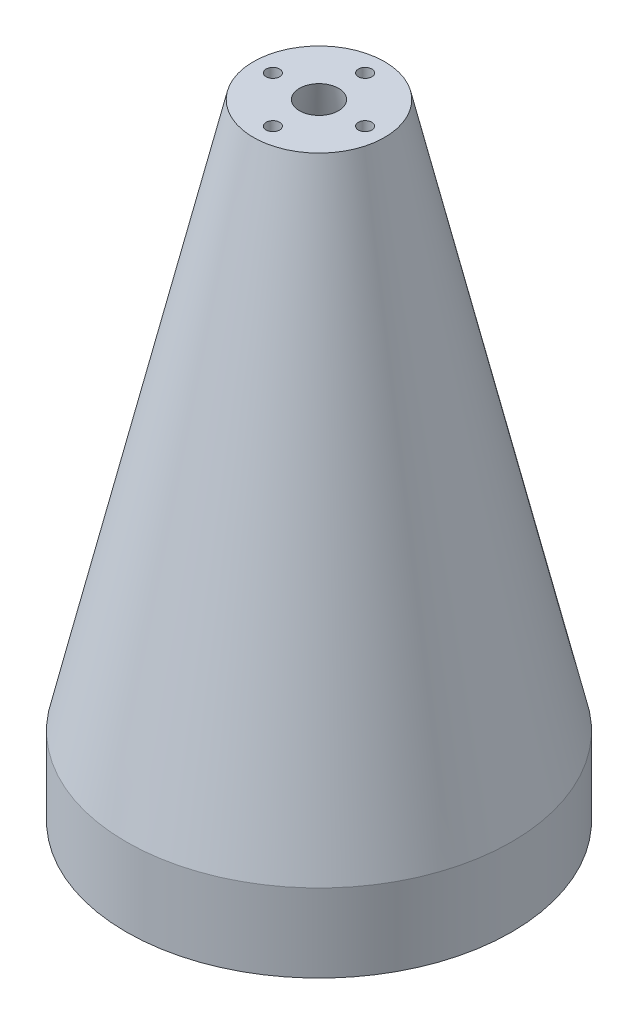
ISO-10303-21;
HEADER;
FILE_DESCRIPTION(('STEP AP214'),'2;1');
FILE_NAME('part.step','',(''),(''),'','','');
FILE_SCHEMA(('AUTOMOTIVE_DESIGN { 1 0 10303 214 1 1 1 1 }'));
ENDSEC;
DATA;
#1=APPLICATION_CONTEXT('core data for automotive mechanical design processes');
#2=APPLICATION_PROTOCOL_DEFINITION('international standard','automotive_design',2000,#1);
#3=PRODUCT_CONTEXT('',#1,'mechanical');
#4=PRODUCT('Part','Part','',(#3));
#5=PRODUCT_RELATED_PRODUCT_CATEGORY('part','',(#4));
#6=PRODUCT_DEFINITION_FORMATION('','',#4);
#7=PRODUCT_DEFINITION_CONTEXT('part definition',#1,'design');
#8=PRODUCT_DEFINITION('design','',#6,#7);
#9=PRODUCT_DEFINITION_SHAPE('','',#8);
#10=(LENGTH_UNIT() NAMED_UNIT(*) SI_UNIT(.MILLI.,.METRE.));
#11=(NAMED_UNIT(*) PLANE_ANGLE_UNIT() SI_UNIT($,.RADIAN.));
#12=(NAMED_UNIT(*) SI_UNIT($,.STERADIAN.) SOLID_ANGLE_UNIT());
#13=UNCERTAINTY_MEASURE_WITH_UNIT(LENGTH_MEASURE(1.E-05),#10,'distance_accuracy_value','');
#14=(GEOMETRIC_REPRESENTATION_CONTEXT(3) GLOBAL_UNCERTAINTY_ASSIGNED_CONTEXT((#13)) GLOBAL_UNIT_ASSIGNED_CONTEXT((#10,
#11,#12)) REPRESENTATION_CONTEXT('',''));
#15=CARTESIAN_POINT('',(0.,0.,0.));
#16=DIRECTION('',(0.,0.,1.));
#17=DIRECTION('',(1.,0.,0.));
#18=AXIS2_PLACEMENT_3D('',#15,#16,#17);
#19=CARTESIAN_POINT('',(0.,0.,0.));
#20=DIRECTION('',(0.,-1.,0.));
#21=DIRECTION('',(0.,0.,-1.));
#22=AXIS2_PLACEMENT_3D('',#19,#20,#21);
#23=CYLINDRICAL_SURFACE('',#22,62.6885);
#24=CARTESIAN_POINT('',(0.,25.4,0.));
#25=DIRECTION('',(0.,-1.,0.));
#26=DIRECTION('',(0.,0.,-1.));
#27=AXIS2_PLACEMENT_3D('',#24,#25,#26);
#28=CIRCLE('',#27,62.6885);
#29=CARTESIAN_POINT('',(0.,25.4,-62.6885));
#30=VERTEX_POINT('',#29);
#31=EDGE_CURVE('E10',#30,#30,#28,.T.);
#32=ORIENTED_EDGE('',*,*,#31,.T.);
#33=EDGE_LOOP('',(#32));
#34=FACE_BOUND('',#33,.T.);
#35=CARTESIAN_POINT('',(0.,0.,0.));
#36=DIRECTION('',(0.,-1.,0.));
#37=DIRECTION('',(0.,0.,-1.));
#38=AXIS2_PLACEMENT_3D('',#35,#36,#37);
#39=CIRCLE('',#38,62.6885);
#40=CARTESIAN_POINT('',(0.,0.,-62.6885));
#41=VERTEX_POINT('',#40);
#42=EDGE_CURVE('E61',#41,#41,#39,.T.);
#43=ORIENTED_EDGE('',*,*,#42,.F.);
#44=EDGE_LOOP('',(#43));
#45=FACE_BOUND('',#44,.T.);
#46=ADVANCED_FACE('F40',(#34,#45),#23,.T.);
#47=CARTESIAN_POINT('',(0.,25.4,0.));
#48=DIRECTION('',(0.,-1.,0.));
#49=DIRECTION('',(0.,0.,-1.));
#50=AXIS2_PLACEMENT_3D('',#47,#48,#49);
#51=CONICAL_SURFACE('',#50,62.6885,0.228441482093904);
#52=CARTESIAN_POINT('',(0.,203.2,0.));
#53=DIRECTION('',(0.,-1.,0.));
#54=DIRECTION('',(0.,0.,-1.));
#55=AXIS2_PLACEMENT_3D('',#52,#53,#54);
#56=CIRCLE('',#55,21.35);
#57=CARTESIAN_POINT('',(0.,203.2,-21.35));
#58=VERTEX_POINT('',#57);
#59=EDGE_CURVE('E43',#58,#58,#56,.T.);
#60=ORIENTED_EDGE('',*,*,#59,.T.);
#61=EDGE_LOOP('',(#60));
#62=FACE_BOUND('',#61,.T.);
#63=ORIENTED_EDGE('',*,*,#31,.F.);
#64=EDGE_LOOP('',(#63));
#65=FACE_BOUND('',#64,.T.);
#66=ADVANCED_FACE('F128',(#62,#65),#51,.T.);
#67=CARTESIAN_POINT('',(21.35,203.2,0.));
#68=DIRECTION('',(0.,1.,0.));
#69=DIRECTION('',(0.,0.,1.));
#70=AXIS2_PLACEMENT_3D('',#67,#68,#69);
#71=PLANE('',#70);
#72=CARTESIAN_POINT('',(-15.,203.2,0.));
#73=DIRECTION('',(0.,1.,0.));
#74=DIRECTION('',(0.,0.,1.));
#75=AXIS2_PLACEMENT_3D('',#72,#73,#74);
#76=CIRCLE('',#75,2.2);
#77=CARTESIAN_POINT('',(-15.,203.2,2.2));
#78=VERTEX_POINT('',#77);
#79=EDGE_CURVE('E112',#78,#78,#76,.T.);
#80=ORIENTED_EDGE('',*,*,#79,.F.);
#81=EDGE_LOOP('',(#80));
#82=FACE_BOUND('',#81,.T.);
#83=CARTESIAN_POINT('',(0.,203.2,-15.));
#84=DIRECTION('',(0.,1.,0.));
#85=DIRECTION('',(0.,0.,1.));
#86=AXIS2_PLACEMENT_3D('',#83,#84,#85);
#87=CIRCLE('',#86,2.2);
#88=CARTESIAN_POINT('',(0.,203.2,-12.8));
#89=VERTEX_POINT('',#88);
#90=EDGE_CURVE('E107',#89,#89,#87,.T.);
#91=ORIENTED_EDGE('',*,*,#90,.F.);
#92=EDGE_LOOP('',(#91));
#93=FACE_BOUND('',#92,.T.);
#94=CARTESIAN_POINT('',(15.,203.2,0.));
#95=DIRECTION('',(0.,1.,0.));
#96=DIRECTION('',(0.,0.,1.));
#97=AXIS2_PLACEMENT_3D('',#94,#95,#96);
#98=CIRCLE('',#97,2.2);
#99=CARTESIAN_POINT('',(15.,203.2,2.2));
#100=VERTEX_POINT('',#99);
#101=EDGE_CURVE('E105',#100,#100,#98,.T.);
#102=ORIENTED_EDGE('',*,*,#101,.F.);
#103=EDGE_LOOP('',(#102));
#104=FACE_BOUND('',#103,.T.);
#105=CARTESIAN_POINT('',(0.,203.2,15.));
#106=DIRECTION('',(0.,1.,0.));
#107=DIRECTION('',(0.,0.,1.));
#108=AXIS2_PLACEMENT_3D('',#105,#106,#107);
#109=CIRCLE('',#108,2.2);
#110=CARTESIAN_POINT('',(0.,203.2,17.2));
#111=VERTEX_POINT('',#110);
#112=EDGE_CURVE('E96',#111,#111,#109,.T.);
#113=ORIENTED_EDGE('',*,*,#112,.F.);
#114=EDGE_LOOP('',(#113));
#115=FACE_BOUND('',#114,.T.);
#116=CARTESIAN_POINT('',(0.,203.2,0.));
#117=DIRECTION('',(0.,-1.,0.));
#118=DIRECTION('',(0.,0.,-1.));
#119=AXIS2_PLACEMENT_3D('',#116,#117,#118);
#120=CIRCLE('',#119,6.35);
#121=CARTESIAN_POINT('',(0.,203.2,-6.35));
#122=VERTEX_POINT('',#121);
#123=EDGE_CURVE('E50',#122,#122,#120,.T.);
#124=ORIENTED_EDGE('',*,*,#123,.T.);
#125=EDGE_LOOP('',(#124));
#126=FACE_BOUND('',#125,.T.);
#127=ORIENTED_EDGE('',*,*,#59,.F.);
#128=EDGE_LOOP('',(#127));
#129=FACE_BOUND('',#128,.T.);
#130=ADVANCED_FACE('F127',(#82,#93,#104,#115,#126,#129),#71,.T.);
#131=CARTESIAN_POINT('',(0.,203.2,0.));
#132=DIRECTION('',(0.,-1.,0.));
#133=DIRECTION('',(0.,0.,-1.));
#134=AXIS2_PLACEMENT_3D('',#131,#132,#133);
#135=CONICAL_SURFACE('',#134,6.35,0.228441482093904);
#136=CARTESIAN_POINT('',(0.,25.4000000000001,0.));
#137=DIRECTION('',(0.,-1.,0.));
#138=DIRECTION('',(0.,0.,-1.));
#139=AXIS2_PLACEMENT_3D('',#136,#137,#138);
#140=CIRCLE('',#139,47.6885);
#141=CARTESIAN_POINT('',(0.,25.4000000000001,-47.6885));
#142=VERTEX_POINT('',#141);
#143=EDGE_CURVE('E51',#142,#142,#140,.T.);
#144=CARTESIAN_POINT('',(0.,25.4000000000001,-47.6885));
#145=CARTESIAN_POINT('',(0.,27.2520833333334,-47.257890625));
#146=CARTESIAN_POINT('',(0.,29.1041666666667,-46.82728125));
#147=CARTESIAN_POINT('',(0.,32.8083333333334,-45.9660625));
#148=CARTESIAN_POINT('',(0.,34.6604166666667,-45.535453125));
#149=CARTESIAN_POINT('',(0.,38.3645833333334,-44.674234375));
#150=CARTESIAN_POINT('',(0.,40.2166666666667,-44.243625));
#151=CARTESIAN_POINT('',(0.,43.9208333333334,-43.38240625));
#152=CARTESIAN_POINT('',(0.,45.7729166666667,-42.951796875));
#153=CARTESIAN_POINT('',(0.,49.4770833333334,-42.090578125));
#154=CARTESIAN_POINT('',(0.,51.3291666666667,-41.65996875));
#155=CARTESIAN_POINT('',(0.,55.0333333333334,-40.79875));
#156=CARTESIAN_POINT('',(0.,56.8854166666667,-40.368140625));
#157=CARTESIAN_POINT('',(0.,60.5895833333334,-39.506921875));
#158=CARTESIAN_POINT('',(0.,62.4416666666667,-39.0763125));
#159=CARTESIAN_POINT('',(0.,66.1458333333334,-38.21509375));
#160=CARTESIAN_POINT('',(0.,67.9979166666667,-37.784484375));
#161=CARTESIAN_POINT('',(0.,71.7020833333334,-36.923265625));
#162=CARTESIAN_POINT('',(0.,73.5541666666667,-36.49265625));
#163=CARTESIAN_POINT('',(0.,77.2583333333334,-35.6314375));
#164=CARTESIAN_POINT('',(0.,79.1104166666667,-35.200828125));
#165=CARTESIAN_POINT('',(0.,82.8145833333334,-34.339609375));
#166=CARTESIAN_POINT('',(0.,84.6666666666667,-33.909));
#167=CARTESIAN_POINT('',(0.,88.3708333333334,-33.04778125));
#168=CARTESIAN_POINT('',(0.,90.2229166666667,-32.617171875));
#169=CARTESIAN_POINT('',(0.,93.9270833333334,-31.755953125));
#170=CARTESIAN_POINT('',(0.,95.7791666666667,-31.32534375));
#171=CARTESIAN_POINT('',(0.,99.4833333333334,-30.464125));
#172=CARTESIAN_POINT('',(0.,101.335416666667,-30.033515625));
#173=CARTESIAN_POINT('',(0.,105.039583333333,-29.172296875));
#174=CARTESIAN_POINT('',(0.,106.891666666667,-28.7416875));
#175=CARTESIAN_POINT('',(0.,110.595833333333,-27.88046875));
#176=CARTESIAN_POINT('',(0.,112.447916666667,-27.449859375));
#177=CARTESIAN_POINT('',(0.,116.152083333333,-26.588640625));
#178=CARTESIAN_POINT('',(0.,118.004166666667,-26.15803125));
#179=CARTESIAN_POINT('',(0.,121.708333333333,-25.2968125));
#180=CARTESIAN_POINT('',(0.,123.560416666667,-24.866203125));
#181=CARTESIAN_POINT('',(0.,127.264583333333,-24.004984375));
#182=CARTESIAN_POINT('',(0.,129.116666666667,-23.574375));
#183=CARTESIAN_POINT('',(0.,132.820833333333,-22.71315625));
#184=CARTESIAN_POINT('',(0.,134.672916666667,-22.282546875));
#185=CARTESIAN_POINT('',(0.,138.377083333333,-21.421328125));
#186=CARTESIAN_POINT('',(0.,140.229166666667,-20.99071875));
#187=CARTESIAN_POINT('',(0.,143.933333333333,-20.1295));
#188=CARTESIAN_POINT('',(0.,145.785416666667,-19.698890625));
#189=CARTESIAN_POINT('',(0.,149.489583333333,-18.837671875));
#190=CARTESIAN_POINT('',(0.,151.341666666667,-18.4070625));
#191=CARTESIAN_POINT('',(0.,155.045833333333,-17.54584375));
#192=CARTESIAN_POINT('',(0.,156.897916666667,-17.115234375));
#193=CARTESIAN_POINT('',(0.,160.602083333333,-16.254015625));
#194=CARTESIAN_POINT('',(0.,162.454166666667,-15.82340625));
#195=CARTESIAN_POINT('',(0.,166.158333333333,-14.9621875));
#196=CARTESIAN_POINT('',(0.,168.010416666667,-14.531578125));
#197=CARTESIAN_POINT('',(0.,171.714583333333,-13.670359375));
#198=CARTESIAN_POINT('',(0.,173.566666666667,-13.23975));
#199=CARTESIAN_POINT('',(0.,177.270833333333,-12.37853125));
#200=CARTESIAN_POINT('',(0.,179.122916666667,-11.947921875));
#201=CARTESIAN_POINT('',(0.,182.827083333333,-11.086703125));
#202=CARTESIAN_POINT('',(0.,184.679166666667,-10.65609375));
#203=CARTESIAN_POINT('',(0.,188.383333333333,-9.79487499999999));
#204=CARTESIAN_POINT('',(0.,190.235416666667,-9.36426562499999));
#205=CARTESIAN_POINT('',(0.,193.939583333333,-8.50304687499999));
#206=CARTESIAN_POINT('',(0.,195.791666666667,-8.07243749999999));
#207=CARTESIAN_POINT('',(0.,199.495833333333,-7.21121874999999));
#208=CARTESIAN_POINT('',(0.,201.347916666667,-6.78060937499999));
#209=CARTESIAN_POINT('',(0.,203.2,-6.34999999999999));
#210=B_SPLINE_CURVE_WITH_KNOTS('',3,(#144,#145,#146,#147,#148,#149,#150,#151,#152,#153,#154,
#155,#156,#157,#158,#159,#160,#161,#162,#163,#164,#165,#166,#167,#168,#169,#170,#171,#172,#173,
#174,#175,#176,#177,#178,#179,#180,#181,#182,#183,#184,#185,#186,#187,#188,#189,#190,#191,#192,
#193,#194,#195,#196,#197,#198,#199,#200,#201,#202,#203,#204,#205,#206,#207,#208,#209),
.UNSPECIFIED.,.F.,.F.,(4,2,2,2,2,2,2,2,2,2,2,2,2,2,2,2,2,2,2,2,2,2,2,2,2,2,2,2,2,2,2,2,4),(0.,
5.70444861200807,11.4088972240162,17.1133458360242,22.8177944480323,28.5222430600404,
34.2266916720485,39.9311402840566,45.6355888960647,51.3400375080728,57.0444861200809,
62.7489347320889,68.453383344097,74.1578319561051,79.8622805681132,85.5667291801213,
91.2711777921294,96.9756264041375,102.680075016146,108.384523628154,114.088972240162,
119.79342085217,125.497869464178,131.202318076186,136.906766688194,142.611215300202,
148.31566391221,154.020112524218,159.724561136226,165.429009748235,171.133458360243,
176.837906972251,182.542355584259),.UNSPECIFIED.);
#211=EDGE_CURVE('BSEAM129',#142,#122,#210,.T.);
#212=ORIENTED_EDGE('',*,*,#143,.T.);
#213=ORIENTED_EDGE('',*,*,#123,.F.);
#214=ORIENTED_EDGE('',*,*,#211,.T.);
#215=ORIENTED_EDGE('',*,*,#211,.F.);
#216=EDGE_LOOP('',(#212,#214,#213,#215));
#217=FACE_BOUND('',#216,.T.);
#218=ADVANCED_FACE('F129',(#217),#135,.F.);
#219=CARTESIAN_POINT('',(0.,0.,0.));
#220=DIRECTION('',(0.,-1.,0.));
#221=DIRECTION('',(0.,0.,-1.));
#222=AXIS2_PLACEMENT_3D('',#219,#220,#221);
#223=CYLINDRICAL_SURFACE('',#222,47.6885);
#224=CARTESIAN_POINT('',(0.,4.064,0.));
#225=DIRECTION('',(0.,-1.,0.));
#226=DIRECTION('',(0.,0.,-1.));
#227=AXIS2_PLACEMENT_3D('',#224,#225,#226);
#228=CIRCLE('',#227,47.6885);
#229=CARTESIAN_POINT('',(0.,4.064,-47.6885));
#230=VERTEX_POINT('',#229);
#231=EDGE_CURVE('E57',#230,#230,#228,.T.);
#232=ORIENTED_EDGE('',*,*,#231,.T.);
#233=EDGE_LOOP('',(#232));
#234=FACE_BOUND('',#233,.T.);
#235=ORIENTED_EDGE('',*,*,#143,.F.);
#236=EDGE_LOOP('',(#235));
#237=FACE_BOUND('',#236,.T.);
#238=ADVANCED_FACE('F142',(#234,#237),#223,.F.);
#239=CARTESIAN_POINT('',(47.6885,4.064,0.));
#240=DIRECTION('',(0.,-1.,0.));
#241=DIRECTION('',(0.,0.,-1.));
#242=AXIS2_PLACEMENT_3D('',#239,#240,#241);
#243=PLANE('',#242);
#244=CARTESIAN_POINT('',(0.,4.064,0.));
#245=DIRECTION('',(0.,-1.,0.));
#246=DIRECTION('',(0.,0.,-1.));
#247=AXIS2_PLACEMENT_3D('',#244,#245,#246);
#248=CIRCLE('',#247,50.8635);
#249=CARTESIAN_POINT('',(0.,4.064,-50.8635));
#250=VERTEX_POINT('',#249);
#251=EDGE_CURVE('E56',#250,#250,#248,.T.);
#252=ORIENTED_EDGE('',*,*,#251,.T.);
#253=EDGE_LOOP('',(#252));
#254=FACE_BOUND('',#253,.T.);
#255=ORIENTED_EDGE('',*,*,#231,.F.);
#256=EDGE_LOOP('',(#255));
#257=FACE_BOUND('',#256,.T.);
#258=ADVANCED_FACE('F149',(#254,#257),#243,.T.);
#259=CARTESIAN_POINT('',(0.,0.,0.));
#260=DIRECTION('',(0.,-1.,0.));
#261=DIRECTION('',(0.,0.,-1.));
#262=AXIS2_PLACEMENT_3D('',#259,#260,#261);
#263=CYLINDRICAL_SURFACE('',#262,50.8635);
#264=CARTESIAN_POINT('',(0.,0.,0.));
#265=DIRECTION('',(0.,-1.,0.));
#266=DIRECTION('',(0.,0.,-1.));
#267=AXIS2_PLACEMENT_3D('',#264,#265,#266);
#268=CIRCLE('',#267,50.8635);
#269=CARTESIAN_POINT('',(0.,0.,-50.8635));
#270=VERTEX_POINT('',#269);
#271=EDGE_CURVE('E64',#270,#270,#268,.T.);
#272=ORIENTED_EDGE('',*,*,#271,.T.);
#273=EDGE_LOOP('',(#272));
#274=FACE_BOUND('',#273,.T.);
#275=ORIENTED_EDGE('',*,*,#251,.F.);
#276=EDGE_LOOP('',(#275));
#277=FACE_BOUND('',#276,.T.);
#278=ADVANCED_FACE('F165',(#274,#277),#263,.F.);
#279=CARTESIAN_POINT('',(50.8635,0.,0.));
#280=DIRECTION('',(0.,-1.,0.));
#281=DIRECTION('',(0.,0.,-1.));
#282=AXIS2_PLACEMENT_3D('',#279,#280,#281);
#283=PLANE('',#282);
#284=CARTESIAN_POINT('',(-57.9825,0.,0.));
#285=DIRECTION('',(0.,-1.,0.));
#286=DIRECTION('',(0.,0.,-1.));
#287=AXIS2_PLACEMENT_3D('',#284,#285,#286);
#288=CIRCLE('',#287,2.2);
#289=CARTESIAN_POINT('',(-57.9825,0.,-2.2));
#290=VERTEX_POINT('',#289);
#291=EDGE_CURVE('E86',#290,#290,#288,.T.);
#292=ORIENTED_EDGE('',*,*,#291,.F.);
#293=EDGE_LOOP('',(#292));
#294=FACE_BOUND('',#293,.T.);
#295=CARTESIAN_POINT('',(0.,0.,57.9825));
#296=DIRECTION('',(0.,-1.,0.));
#297=DIRECTION('',(0.,0.,-1.));
#298=AXIS2_PLACEMENT_3D('',#295,#296,#297);
#299=CIRCLE('',#298,2.2);
#300=CARTESIAN_POINT('',(0.,0.,55.7825));
#301=VERTEX_POINT('',#300);
#302=EDGE_CURVE('E84',#301,#301,#299,.T.);
#303=ORIENTED_EDGE('',*,*,#302,.F.);
#304=EDGE_LOOP('',(#303));
#305=FACE_BOUND('',#304,.T.);
#306=CARTESIAN_POINT('',(57.9825,0.,0.));
#307=DIRECTION('',(0.,-1.,0.));
#308=DIRECTION('',(0.,0.,-1.));
#309=AXIS2_PLACEMENT_3D('',#306,#307,#308);
#310=CIRCLE('',#309,2.2);
#311=CARTESIAN_POINT('',(57.9825,0.,-2.2));
#312=VERTEX_POINT('',#311);
#313=EDGE_CURVE('E80',#312,#312,#310,.T.);
#314=ORIENTED_EDGE('',*,*,#313,.F.);
#315=EDGE_LOOP('',(#314));
#316=FACE_BOUND('',#315,.T.);
#317=CARTESIAN_POINT('',(0.,0.,-57.9825));
#318=DIRECTION('',(0.,-1.,0.));
#319=DIRECTION('',(0.,0.,-1.));
#320=AXIS2_PLACEMENT_3D('',#317,#318,#319);
#321=CIRCLE('',#320,2.2);
#322=CARTESIAN_POINT('',(0.,0.,-60.1825));
#323=VERTEX_POINT('',#322);
#324=EDGE_CURVE('E75',#323,#323,#321,.T.);
#325=ORIENTED_EDGE('',*,*,#324,.F.);
#326=EDGE_LOOP('',(#325));
#327=FACE_BOUND('',#326,.T.);
#328=ORIENTED_EDGE('',*,*,#42,.T.);
#329=EDGE_LOOP('',(#328));
#330=FACE_BOUND('',#329,.T.);
#331=ORIENTED_EDGE('',*,*,#271,.F.);
#332=EDGE_LOOP('',(#331));
#333=FACE_BOUND('',#332,.T.);
#334=ADVANCED_FACE('F158',(#294,#305,#316,#327,#330,#333),#283,.T.);
#335=CARTESIAN_POINT('',(0.,10.,-57.9825));
#336=DIRECTION('',(0.,-1.,0.));
#337=DIRECTION('',(0.,0.,-1.));
#338=AXIS2_PLACEMENT_3D('',#335,#336,#337);
#339=CYLINDRICAL_SURFACE('',#338,2.2);
#340=CARTESIAN_POINT('',(0.,10.,-57.9825));
#341=DIRECTION('',(0.,-1.,0.));
#342=DIRECTION('',(0.,0.,-1.));
#343=AXIS2_PLACEMENT_3D('',#340,#341,#342);
#344=CIRCLE('',#343,2.2);
#345=CARTESIAN_POINT('',(0.,10.,-60.1825));
#346=VERTEX_POINT('',#345);
#347=EDGE_CURVE('E67',#346,#346,#344,.T.);
#348=ORIENTED_EDGE('',*,*,#347,.F.);
#349=EDGE_LOOP('',(#348));
#350=FACE_BOUND('',#349,.T.);
#351=ORIENTED_EDGE('',*,*,#324,.T.);
#352=EDGE_LOOP('',(#351));
#353=FACE_BOUND('',#352,.T.);
#354=ADVANCED_FACE('F161',(#350,#353),#339,.F.);
#355=CARTESIAN_POINT('',(0.,10.,-57.9825));
#356=DIRECTION('',(0.,-1.,0.));
#357=DIRECTION('',(0.,0.,-1.));
#358=AXIS2_PLACEMENT_3D('',#355,#356,#357);
#359=PLANE('',#358);
#360=ORIENTED_EDGE('',*,*,#347,.T.);
#361=EDGE_LOOP('',(#360));
#362=FACE_BOUND('',#361,.T.);
#363=ADVANCED_FACE('F182',(#362),#359,.T.);
#364=CARTESIAN_POINT('',(57.9825,10.,0.));
#365=DIRECTION('',(0.,-1.,0.));
#366=DIRECTION('',(0.,0.,-1.));
#367=AXIS2_PLACEMENT_3D('',#364,#365,#366);
#368=CYLINDRICAL_SURFACE('',#367,2.2);
#369=CARTESIAN_POINT('',(57.9825,10.,0.));
#370=DIRECTION('',(0.,-1.,0.));
#371=DIRECTION('',(0.,0.,-1.));
#372=AXIS2_PLACEMENT_3D('',#369,#370,#371);
#373=CIRCLE('',#372,2.2);
#374=CARTESIAN_POINT('',(57.9825,10.,-2.2));
#375=VERTEX_POINT('',#374);
#376=EDGE_CURVE('E78',#375,#375,#373,.T.);
#377=ORIENTED_EDGE('',*,*,#376,.F.);
#378=EDGE_LOOP('',(#377));
#379=FACE_BOUND('',#378,.T.);
#380=ORIENTED_EDGE('',*,*,#313,.T.);
#381=EDGE_LOOP('',(#380));
#382=FACE_BOUND('',#381,.T.);
#383=ADVANCED_FACE('F184',(#379,#382),#368,.F.);
#384=CARTESIAN_POINT('',(57.9825,10.,0.));
#385=DIRECTION('',(0.,-1.,0.));
#386=DIRECTION('',(0.,0.,-1.));
#387=AXIS2_PLACEMENT_3D('',#384,#385,#386);
#388=PLANE('',#387);
#389=ORIENTED_EDGE('',*,*,#376,.T.);
#390=EDGE_LOOP('',(#389));
#391=FACE_BOUND('',#390,.T.);
#392=ADVANCED_FACE('F190',(#391),#388,.T.);
#393=CARTESIAN_POINT('',(0.,10.,57.9825));
#394=DIRECTION('',(0.,-1.,0.));
#395=DIRECTION('',(0.,0.,-1.));
#396=AXIS2_PLACEMENT_3D('',#393,#394,#395);
#397=CYLINDRICAL_SURFACE('',#396,2.2);
#398=CARTESIAN_POINT('',(0.,10.,57.9825));
#399=DIRECTION('',(0.,-1.,0.));
#400=DIRECTION('',(0.,0.,-1.));
#401=AXIS2_PLACEMENT_3D('',#398,#399,#400);
#402=CIRCLE('',#401,2.2);
#403=CARTESIAN_POINT('',(0.,10.,55.7825));
#404=VERTEX_POINT('',#403);
#405=EDGE_CURVE('E85',#404,#404,#402,.T.);
#406=ORIENTED_EDGE('',*,*,#405,.F.);
#407=EDGE_LOOP('',(#406));
#408=FACE_BOUND('',#407,.T.);
#409=ORIENTED_EDGE('',*,*,#302,.T.);
#410=EDGE_LOOP('',(#409));
#411=FACE_BOUND('',#410,.T.);
#412=ADVANCED_FACE('F195',(#408,#411),#397,.F.);
#413=CARTESIAN_POINT('',(0.,10.,57.9825));
#414=DIRECTION('',(0.,-1.,0.));
#415=DIRECTION('',(0.,0.,-1.));
#416=AXIS2_PLACEMENT_3D('',#413,#414,#415);
#417=PLANE('',#416);
#418=ORIENTED_EDGE('',*,*,#405,.T.);
#419=EDGE_LOOP('',(#418));
#420=FACE_BOUND('',#419,.T.);
#421=ADVANCED_FACE('F197',(#420),#417,.T.);
#422=CARTESIAN_POINT('',(-57.9825,10.,0.));
#423=DIRECTION('',(0.,-1.,0.));
#424=DIRECTION('',(0.,0.,-1.));
#425=AXIS2_PLACEMENT_3D('',#422,#423,#424);
#426=CYLINDRICAL_SURFACE('',#425,2.2);
#427=CARTESIAN_POINT('',(-57.9825,10.,0.));
#428=DIRECTION('',(0.,-1.,0.));
#429=DIRECTION('',(0.,0.,-1.));
#430=AXIS2_PLACEMENT_3D('',#427,#428,#429);
#431=CIRCLE('',#430,2.2);
#432=CARTESIAN_POINT('',(-57.9825,10.,-2.2));
#433=VERTEX_POINT('',#432);
#434=EDGE_CURVE('E66',#433,#433,#431,.T.);
#435=ORIENTED_EDGE('',*,*,#434,.F.);
#436=EDGE_LOOP('',(#435));
#437=FACE_BOUND('',#436,.T.);
#438=ORIENTED_EDGE('',*,*,#291,.T.);
#439=EDGE_LOOP('',(#438));
#440=FACE_BOUND('',#439,.T.);
#441=ADVANCED_FACE('F199',(#437,#440),#426,.F.);
#442=CARTESIAN_POINT('',(-57.9825,10.,0.));
#443=DIRECTION('',(0.,-1.,0.));
#444=DIRECTION('',(0.,0.,-1.));
#445=AXIS2_PLACEMENT_3D('',#442,#443,#444);
#446=PLANE('',#445);
#447=ORIENTED_EDGE('',*,*,#434,.T.);
#448=EDGE_LOOP('',(#447));
#449=FACE_BOUND('',#448,.T.);
#450=ADVANCED_FACE('F210',(#449),#446,.T.);
#451=CARTESIAN_POINT('',(0.,193.2,15.));
#452=DIRECTION('',(0.,1.,0.));
#453=DIRECTION('',(0.,0.,1.));
#454=AXIS2_PLACEMENT_3D('',#451,#452,#453);
#455=CYLINDRICAL_SURFACE('',#454,2.2);
#456=CARTESIAN_POINT('',(0.,193.2,15.));
#457=DIRECTION('',(0.,1.,0.));
#458=DIRECTION('',(0.,0.,1.));
#459=AXIS2_PLACEMENT_3D('',#456,#457,#458);
#460=CIRCLE('',#459,2.2);
#461=CARTESIAN_POINT('',(0.,193.2,17.2));
#462=VERTEX_POINT('',#461);
#463=EDGE_CURVE('E91',#462,#462,#460,.T.);
#464=ORIENTED_EDGE('',*,*,#463,.F.);
#465=EDGE_LOOP('',(#464));
#466=FACE_BOUND('',#465,.T.);
#467=ORIENTED_EDGE('',*,*,#112,.T.);
#468=EDGE_LOOP('',(#467));
#469=FACE_BOUND('',#468,.T.);
#470=ADVANCED_FACE('F211',(#466,#469),#455,.F.);
#471=CARTESIAN_POINT('',(0.,193.2,15.));
#472=DIRECTION('',(0.,1.,0.));
#473=DIRECTION('',(0.,0.,1.));
#474=AXIS2_PLACEMENT_3D('',#471,#472,#473);
#475=PLANE('',#474);
#476=ORIENTED_EDGE('',*,*,#463,.T.);
#477=EDGE_LOOP('',(#476));
#478=FACE_BOUND('',#477,.T.);
#479=ADVANCED_FACE('F213',(#478),#475,.T.);
#480=CARTESIAN_POINT('',(15.,193.2,0.));
#481=DIRECTION('',(0.,1.,0.));
#482=DIRECTION('',(0.,0.,1.));
#483=AXIS2_PLACEMENT_3D('',#480,#481,#482);
#484=CYLINDRICAL_SURFACE('',#483,2.2);
#485=CARTESIAN_POINT('',(15.,193.2,0.));
#486=DIRECTION('',(0.,1.,0.));
#487=DIRECTION('',(0.,0.,1.));
#488=AXIS2_PLACEMENT_3D('',#485,#486,#487);
#489=CIRCLE('',#488,2.2);
#490=CARTESIAN_POINT('',(15.,193.2,2.2));
#491=VERTEX_POINT('',#490);
#492=EDGE_CURVE('E97',#491,#491,#489,.T.);
#493=ORIENTED_EDGE('',*,*,#492,.F.);
#494=EDGE_LOOP('',(#493));
#495=FACE_BOUND('',#494,.T.);
#496=ORIENTED_EDGE('',*,*,#101,.T.);
#497=EDGE_LOOP('',(#496));
#498=FACE_BOUND('',#497,.T.);
#499=ADVANCED_FACE('F216',(#495,#498),#484,.F.);
#500=CARTESIAN_POINT('',(15.,193.2,0.));
#501=DIRECTION('',(0.,1.,0.));
#502=DIRECTION('',(0.,0.,1.));
#503=AXIS2_PLACEMENT_3D('',#500,#501,#502);
#504=PLANE('',#503);
#505=ORIENTED_EDGE('',*,*,#492,.T.);
#506=EDGE_LOOP('',(#505));
#507=FACE_BOUND('',#506,.T.);
#508=ADVANCED_FACE('F222',(#507),#504,.T.);
#509=CARTESIAN_POINT('',(0.,193.2,-15.));
#510=DIRECTION('',(0.,1.,0.));
#511=DIRECTION('',(0.,0.,1.));
#512=AXIS2_PLACEMENT_3D('',#509,#510,#511);
#513=CYLINDRICAL_SURFACE('',#512,2.2);
#514=CARTESIAN_POINT('',(0.,193.2,-15.));
#515=DIRECTION('',(0.,1.,0.));
#516=DIRECTION('',(0.,0.,1.));
#517=AXIS2_PLACEMENT_3D('',#514,#515,#516);
#518=CIRCLE('',#517,2.2);
#519=CARTESIAN_POINT('',(0.,193.2,-12.8));
#520=VERTEX_POINT('',#519);
#521=EDGE_CURVE('E104',#520,#520,#518,.T.);
#522=ORIENTED_EDGE('',*,*,#521,.F.);
#523=EDGE_LOOP('',(#522));
#524=FACE_BOUND('',#523,.T.);
#525=ORIENTED_EDGE('',*,*,#90,.T.);
#526=EDGE_LOOP('',(#525));
#527=FACE_BOUND('',#526,.T.);
#528=ADVANCED_FACE('F221',(#524,#527),#513,.F.);
#529=CARTESIAN_POINT('',(0.,193.2,-15.));
#530=DIRECTION('',(0.,1.,0.));
#531=DIRECTION('',(0.,0.,1.));
#532=AXIS2_PLACEMENT_3D('',#529,#530,#531);
#533=PLANE('',#532);
#534=ORIENTED_EDGE('',*,*,#521,.T.);
#535=EDGE_LOOP('',(#534));
#536=FACE_BOUND('',#535,.T.);
#537=ADVANCED_FACE('F125',(#536),#533,.T.);
#538=CARTESIAN_POINT('',(-15.,193.2,0.));
#539=DIRECTION('',(0.,1.,0.));
#540=DIRECTION('',(0.,0.,1.));
#541=AXIS2_PLACEMENT_3D('',#538,#539,#540);
#542=CYLINDRICAL_SURFACE('',#541,2.2);
#543=CARTESIAN_POINT('',(-15.,193.2,0.));
#544=DIRECTION('',(0.,1.,0.));
#545=DIRECTION('',(0.,0.,1.));
#546=AXIS2_PLACEMENT_3D('',#543,#544,#545);
#547=CIRCLE('',#546,2.2);
#548=CARTESIAN_POINT('',(-15.,193.2,2.2));
#549=VERTEX_POINT('',#548);
#550=EDGE_CURVE('E71',#549,#549,#547,.T.);
#551=ORIENTED_EDGE('',*,*,#550,.F.);
#552=EDGE_LOOP('',(#551));
#553=FACE_BOUND('',#552,.T.);
#554=ORIENTED_EDGE('',*,*,#79,.T.);
#555=EDGE_LOOP('',(#554));
#556=FACE_BOUND('',#555,.T.);
#557=ADVANCED_FACE('F120',(#553,#556),#542,.F.);
#558=CARTESIAN_POINT('',(-15.,193.2,0.));
#559=DIRECTION('',(0.,1.,0.));
#560=DIRECTION('',(0.,0.,1.));
#561=AXIS2_PLACEMENT_3D('',#558,#559,#560);
#562=PLANE('',#561);
#563=ORIENTED_EDGE('',*,*,#550,.T.);
#564=EDGE_LOOP('',(#563));
#565=FACE_BOUND('',#564,.T.);
#566=ADVANCED_FACE('F119',(#565),#562,.T.);
#567=CLOSED_SHELL('',(#46,#66,#130,#218,#238,#258,#278,#334,#354,#363,#383,#392,#412,#421,#441,
#450,#470,#479,#499,#508,#528,#537,#557,#566));
#568=MANIFOLD_SOLID_BREP('B2',#567);
#569=ADVANCED_BREP_SHAPE_REPRESENTATION('',(#18,#568),#14);
#570=SHAPE_DEFINITION_REPRESENTATION(#9,#569);
ENDSEC;
END-ISO-10303-21;
